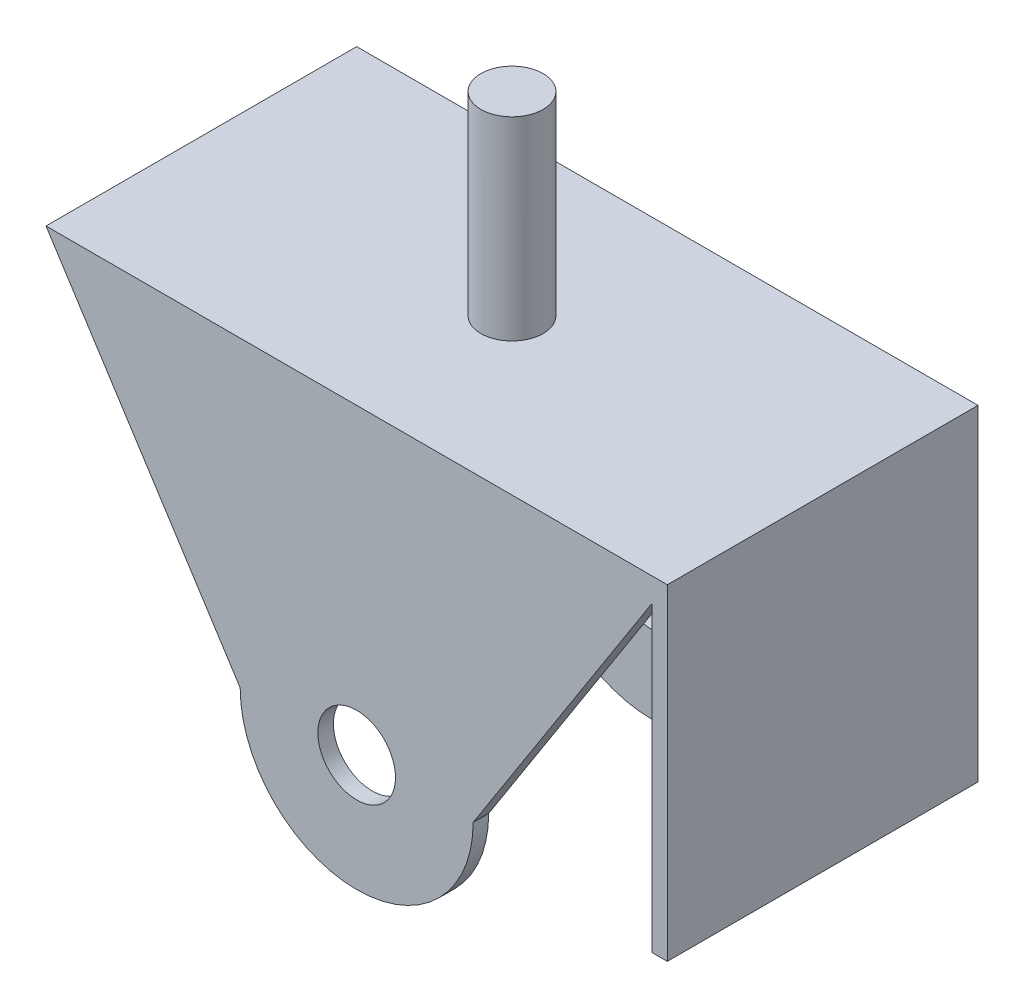
ISO-10303-21;
HEADER;
FILE_DESCRIPTION(('STEP AP214'),'2;1');
FILE_NAME('part.step','',(''),(''),'','','');
FILE_SCHEMA(('AUTOMOTIVE_DESIGN { 1 0 10303 214 1 1 1 1 }'));
ENDSEC;
DATA;
#1=APPLICATION_CONTEXT('core data for automotive mechanical design processes');
#2=APPLICATION_PROTOCOL_DEFINITION('international standard','automotive_design',2000,#1);
#3=PRODUCT_CONTEXT('',#1,'mechanical');
#4=PRODUCT('Part','Part','',(#3));
#5=PRODUCT_RELATED_PRODUCT_CATEGORY('part','',(#4));
#6=PRODUCT_DEFINITION_FORMATION('','',#4);
#7=PRODUCT_DEFINITION_CONTEXT('part definition',#1,'design');
#8=PRODUCT_DEFINITION('design','',#6,#7);
#9=PRODUCT_DEFINITION_SHAPE('','',#8);
#10=(LENGTH_UNIT() NAMED_UNIT(*) SI_UNIT(.MILLI.,.METRE.));
#11=(NAMED_UNIT(*) PLANE_ANGLE_UNIT() SI_UNIT($,.RADIAN.));
#12=(NAMED_UNIT(*) SI_UNIT($,.STERADIAN.) SOLID_ANGLE_UNIT());
#13=UNCERTAINTY_MEASURE_WITH_UNIT(LENGTH_MEASURE(1.E-05),#10,'distance_accuracy_value','');
#14=(GEOMETRIC_REPRESENTATION_CONTEXT(3) GLOBAL_UNCERTAINTY_ASSIGNED_CONTEXT((#13)) GLOBAL_UNIT_ASSIGNED_CONTEXT((#10,
#11,#12)) REPRESENTATION_CONTEXT('',''));
#15=CARTESIAN_POINT('',(0.,0.,0.));
#16=DIRECTION('',(0.,0.,1.));
#17=DIRECTION('',(1.,0.,0.));
#18=AXIS2_PLACEMENT_3D('',#15,#16,#17);
#19=CARTESIAN_POINT('',(15.,0.,40.));
#20=DIRECTION('',(-0.841879138963874,0.539666114720432,0.));
#21=DIRECTION('',(-0.539666114720432,-0.841879138963874,0.));
#22=AXIS2_PLACEMENT_3D('',#19,#20,#21);
#23=PLANE('',#22);
#24=DIRECTION('',(0.539666114720432,0.841879138963874,0.));
#25=VECTOR('',#24,1.);
#26=CARTESIAN_POINT('',(15.,0.,0.));
#27=LINE('',#26,#25);
#28=CARTESIAN_POINT('',(15.,0.,0.));
#29=VERTEX_POINT('',#28);
#30=CARTESIAN_POINT('',(38.,35.88,0.));
#31=VERTEX_POINT('',#30);
#32=EDGE_CURVE('E60',#29,#31,#27,.T.);
#33=ORIENTED_EDGE('',*,*,#32,.T.);
#34=DIRECTION('',(0.,0.,1.));
#35=VECTOR('',#34,1.);
#36=CARTESIAN_POINT('',(38.,35.88,40.));
#37=LINE('',#36,#35);
#38=CARTESIAN_POINT('',(38.,35.88,2.));
#39=VERTEX_POINT('',#38);
#40=EDGE_CURVE('E169',#31,#39,#37,.T.);
#41=ORIENTED_EDGE('',*,*,#40,.T.);
#42=DIRECTION('',(0.539666114720432,0.841879138963874,0.));
#43=VECTOR('',#42,1.);
#44=CARTESIAN_POINT('',(15.,0.,2.));
#45=LINE('',#44,#43);
#46=CARTESIAN_POINT('',(15.,0.,2.));
#47=VERTEX_POINT('',#46);
#48=EDGE_CURVE('E181',#47,#39,#45,.T.);
#49=ORIENTED_EDGE('',*,*,#48,.F.);
#50=DIRECTION('',(0.,0.,-1.));
#51=VECTOR('',#50,1.);
#52=CARTESIAN_POINT('',(15.,0.,40.));
#53=LINE('',#52,#51);
#54=EDGE_CURVE('E223',#47,#29,#53,.T.);
#55=ORIENTED_EDGE('',*,*,#54,.T.);
#56=EDGE_LOOP('',(#33,#41,#49,#55));
#57=FACE_BOUND('',#56,.T.);
#58=ADVANCED_FACE('F37',(#57),#23,.F.);
#59=CARTESIAN_POINT('',(0.,0.,40.));
#60=DIRECTION('',(0.,0.,-1.));
#61=DIRECTION('',(-1.,0.,0.));
#62=AXIS2_PLACEMENT_3D('',#59,#60,#61);
#63=CYLINDRICAL_SURFACE('',#62,15.);
#64=CARTESIAN_POINT('',(0.,0.,2.));
#65=DIRECTION('',(0.,0.,1.));
#66=DIRECTION('',(1.,0.,0.));
#67=AXIS2_PLACEMENT_3D('',#64,#65,#66);
#68=CIRCLE('',#67,15.);
#69=CARTESIAN_POINT('',(-15.,0.,2.));
#70=VERTEX_POINT('',#69);
#71=EDGE_CURVE('E183',#70,#47,#68,.T.);
#72=ORIENTED_EDGE('',*,*,#71,.F.);
#73=DIRECTION('',(0.,0.,-1.));
#74=VECTOR('',#73,1.);
#75=CARTESIAN_POINT('',(-15.,0.,40.));
#76=LINE('',#75,#74);
#77=CARTESIAN_POINT('',(-15.,0.,0.));
#78=VERTEX_POINT('',#77);
#79=EDGE_CURVE('E227',#70,#78,#76,.T.);
#80=ORIENTED_EDGE('',*,*,#79,.T.);
#81=CARTESIAN_POINT('',(0.,0.,0.));
#82=DIRECTION('',(0.,0.,1.));
#83=DIRECTION('',(1.,0.,0.));
#84=AXIS2_PLACEMENT_3D('',#81,#82,#83);
#85=CIRCLE('',#84,15.);
#86=EDGE_CURVE('E218',#78,#29,#85,.T.);
#87=ORIENTED_EDGE('',*,*,#86,.T.);
#88=ORIENTED_EDGE('',*,*,#54,.F.);
#89=EDGE_LOOP('',(#72,#80,#87,#88));
#90=FACE_BOUND('',#89,.T.);
#91=ADVANCED_FACE('F261',(#90),#63,.T.);
#92=CARTESIAN_POINT('',(0.,0.,40.));
#93=DIRECTION('',(0.,0.,-1.));
#94=DIRECTION('',(-1.,0.,0.));
#95=AXIS2_PLACEMENT_3D('',#92,#93,#94);
#96=CYLINDRICAL_SURFACE('',#95,5.);
#97=CARTESIAN_POINT('',(0.,0.,0.));
#98=DIRECTION('',(0.,0.,1.));
#99=DIRECTION('',(1.,0.,0.));
#100=AXIS2_PLACEMENT_3D('',#97,#98,#99);
#101=CIRCLE('',#100,5.);
#102=CARTESIAN_POINT('',(5.,0.,0.));
#103=VERTEX_POINT('',#102);
#104=EDGE_CURVE('E199',#103,#103,#101,.T.);
#105=ORIENTED_EDGE('',*,*,#104,.F.);
#106=EDGE_LOOP('',(#105));
#107=FACE_BOUND('',#106,.T.);
#108=CARTESIAN_POINT('',(0.,0.,2.));
#109=DIRECTION('',(0.,0.,1.));
#110=DIRECTION('',(1.,0.,0.));
#111=AXIS2_PLACEMENT_3D('',#108,#109,#110);
#112=CIRCLE('',#111,5.);
#113=CARTESIAN_POINT('',(5.,0.,2.));
#114=VERTEX_POINT('',#113);
#115=EDGE_CURVE('E180',#114,#114,#112,.T.);
#116=ORIENTED_EDGE('',*,*,#115,.T.);
#117=EDGE_LOOP('',(#116));
#118=FACE_BOUND('',#117,.T.);
#119=ADVANCED_FACE('F288',(#107,#118),#96,.F.);
#120=CARTESIAN_POINT('',(0.,0.,40.));
#121=DIRECTION('',(0.,0.,1.));
#122=DIRECTION('',(1.,0.,0.));
#123=AXIS2_PLACEMENT_3D('',#120,#121,#122);
#124=PLANE('',#123);
#125=DIRECTION('',(0.539666114720432,0.841879138963874,0.));
#126=VECTOR('',#125,1.);
#127=CARTESIAN_POINT('',(15.,0.,40.));
#128=LINE('',#127,#126);
#129=CARTESIAN_POINT('',(15.,0.,40.));
#130=VERTEX_POINT('',#129);
#131=CARTESIAN_POINT('',(38.,35.88,40.));
#132=VERTEX_POINT('',#131);
#133=EDGE_CURVE('E211',#130,#132,#128,.T.);
#134=ORIENTED_EDGE('',*,*,#133,.T.);
#135=DIRECTION('',(0.,1.,0.));
#136=VECTOR('',#135,1.);
#137=CARTESIAN_POINT('',(38.,-3.,40.));
#138=LINE('',#137,#136);
#139=CARTESIAN_POINT('',(38.,-3.,40.));
#140=VERTEX_POINT('',#139);
#141=EDGE_CURVE('E163',#140,#132,#138,.T.);
#142=ORIENTED_EDGE('',*,*,#141,.F.);
#143=DIRECTION('',(1.,0.,0.));
#144=VECTOR('',#143,1.);
#145=CARTESIAN_POINT('',(40.,-3.,40.));
#146=LINE('',#145,#144);
#147=CARTESIAN_POINT('',(40.,-3.,40.));
#148=VERTEX_POINT('',#147);
#149=EDGE_CURVE('E142',#140,#148,#146,.T.);
#150=ORIENTED_EDGE('',*,*,#149,.T.);
#151=DIRECTION('',(0.,1.,0.));
#152=VECTOR('',#151,1.);
#153=CARTESIAN_POINT('',(40.,-3.,40.));
#154=LINE('',#153,#152);
#155=CARTESIAN_POINT('',(40.,39.,40.));
#156=VERTEX_POINT('',#155);
#157=EDGE_CURVE('E156',#148,#156,#154,.T.);
#158=ORIENTED_EDGE('',*,*,#157,.T.);
#159=DIRECTION('',(-1.,0.,0.));
#160=VECTOR('',#159,1.);
#161=CARTESIAN_POINT('',(0.,39.,40.));
#162=LINE('',#161,#160);
#163=CARTESIAN_POINT('',(-40.,39.,40.));
#164=VERTEX_POINT('',#163);
#165=EDGE_CURVE('E205',#156,#164,#162,.T.);
#166=ORIENTED_EDGE('',*,*,#165,.T.);
#167=DIRECTION('',(0.539666114720432,-0.841879138963874,0.));
#168=VECTOR('',#167,1.);
#169=CARTESIAN_POINT('',(-40.,39.,40.));
#170=LINE('',#169,#168);
#171=CARTESIAN_POINT('',(-15.,0.,40.));
#172=VERTEX_POINT('',#171);
#173=EDGE_CURVE('E207',#164,#172,#170,.T.);
#174=ORIENTED_EDGE('',*,*,#173,.T.);
#175=CARTESIAN_POINT('',(0.,0.,40.));
#176=DIRECTION('',(0.,0.,1.));
#177=DIRECTION('',(1.,0.,0.));
#178=AXIS2_PLACEMENT_3D('',#175,#176,#177);
#179=CIRCLE('',#178,15.);
#180=EDGE_CURVE('E209',#172,#130,#179,.T.);
#181=ORIENTED_EDGE('',*,*,#180,.T.);
#182=EDGE_LOOP('',(#134,#142,#150,#158,#166,#174,#181));
#183=FACE_BOUND('',#182,.T.);
#184=CARTESIAN_POINT('',(0.,0.,40.));
#185=DIRECTION('',(0.,0.,1.));
#186=DIRECTION('',(1.,0.,0.));
#187=AXIS2_PLACEMENT_3D('',#184,#185,#186);
#188=CIRCLE('',#187,5.);
#189=CARTESIAN_POINT('',(5.,0.,40.));
#190=VERTEX_POINT('',#189);
#191=EDGE_CURVE('E200',#190,#190,#188,.T.);
#192=ORIENTED_EDGE('',*,*,#191,.F.);
#193=EDGE_LOOP('',(#192));
#194=FACE_BOUND('',#193,.T.);
#195=ADVANCED_FACE('F252',(#183,#194),#124,.T.);
#196=CARTESIAN_POINT('',(0.,0.,0.));
#197=DIRECTION('',(0.,0.,1.));
#198=DIRECTION('',(1.,0.,0.));
#199=AXIS2_PLACEMENT_3D('',#196,#197,#198);
#200=PLANE('',#199);
#201=DIRECTION('',(0.539666114720432,-0.841879138963874,0.));
#202=VECTOR('',#201,1.);
#203=CARTESIAN_POINT('',(-40.,39.,0.));
#204=LINE('',#203,#202);
#205=CARTESIAN_POINT('',(-40.,39.,0.));
#206=VERTEX_POINT('',#205);
#207=EDGE_CURVE('E215',#206,#78,#204,.T.);
#208=ORIENTED_EDGE('',*,*,#207,.F.);
#209=DIRECTION('',(-1.,0.,0.));
#210=VECTOR('',#209,1.);
#211=CARTESIAN_POINT('',(0.,39.,0.));
#212=LINE('',#211,#210);
#213=CARTESIAN_POINT('',(40.,39.,0.));
#214=VERTEX_POINT('',#213);
#215=EDGE_CURVE('E136',#214,#206,#212,.T.);
#216=ORIENTED_EDGE('',*,*,#215,.F.);
#217=DIRECTION('',(0.,1.,0.));
#218=VECTOR('',#217,1.);
#219=CARTESIAN_POINT('',(40.,-3.,0.));
#220=LINE('',#219,#218);
#221=CARTESIAN_POINT('',(40.,-3.,0.));
#222=VERTEX_POINT('',#221);
#223=EDGE_CURVE('E129',#222,#214,#220,.T.);
#224=ORIENTED_EDGE('',*,*,#223,.F.);
#225=DIRECTION('',(-1.,0.,0.));
#226=VECTOR('',#225,1.);
#227=CARTESIAN_POINT('',(40.,-3.,0.));
#228=LINE('',#227,#226);
#229=CARTESIAN_POINT('',(38.,-3.,0.));
#230=VERTEX_POINT('',#229);
#231=EDGE_CURVE('E135',#222,#230,#228,.T.);
#232=ORIENTED_EDGE('',*,*,#231,.T.);
#233=DIRECTION('',(0.,1.,0.));
#234=VECTOR('',#233,1.);
#235=CARTESIAN_POINT('',(38.,-3.,0.));
#236=LINE('',#235,#234);
#237=EDGE_CURVE('E141',#230,#31,#236,.T.);
#238=ORIENTED_EDGE('',*,*,#237,.T.);
#239=ORIENTED_EDGE('',*,*,#32,.F.);
#240=ORIENTED_EDGE('',*,*,#86,.F.);
#241=EDGE_LOOP('',(#208,#216,#224,#232,#238,#239,#240));
#242=FACE_BOUND('',#241,.T.);
#243=ORIENTED_EDGE('',*,*,#104,.T.);
#244=EDGE_LOOP('',(#243));
#245=FACE_BOUND('',#244,.T.);
#246=ADVANCED_FACE('F132',(#242,#245),#200,.F.);
#247=CARTESIAN_POINT('',(0.,39.,40.));
#248=DIRECTION('',(0.,-1.,0.));
#249=DIRECTION('',(1.,0.,0.));
#250=AXIS2_PLACEMENT_3D('',#247,#248,#249);
#251=PLANE('',#250);
#252=CARTESIAN_POINT('',(0.,39.,20.));
#253=DIRECTION('',(0.,-1.,0.));
#254=DIRECTION('',(1.,0.,0.));
#255=AXIS2_PLACEMENT_3D('',#252,#253,#254);
#256=CIRCLE('',#255,4.);
#257=CARTESIAN_POINT('',(4.,39.,20.));
#258=VERTEX_POINT('',#257);
#259=EDGE_CURVE('E45',#258,#258,#256,.F.);
#260=ORIENTED_EDGE('',*,*,#259,.F.);
#261=EDGE_LOOP('',(#260));
#262=FACE_BOUND('',#261,.T.);
#263=DIRECTION('',(0.,0.,-1.));
#264=VECTOR('',#263,1.);
#265=CARTESIAN_POINT('',(-40.,39.,40.));
#266=LINE('',#265,#264);
#267=EDGE_CURVE('E231',#164,#206,#266,.T.);
#268=ORIENTED_EDGE('',*,*,#267,.F.);
#269=ORIENTED_EDGE('',*,*,#165,.F.);
#270=DIRECTION('',(0.,0.,-1.));
#271=VECTOR('',#270,1.);
#272=CARTESIAN_POINT('',(40.,39.,40.));
#273=LINE('',#272,#271);
#274=EDGE_CURVE('E213',#156,#214,#273,.T.);
#275=ORIENTED_EDGE('',*,*,#274,.T.);
#276=ORIENTED_EDGE('',*,*,#215,.T.);
#277=EDGE_LOOP('',(#268,#269,#275,#276));
#278=FACE_BOUND('',#277,.T.);
#279=ADVANCED_FACE('F39',(#262,#278),#251,.F.);
#280=CARTESIAN_POINT('',(-40.,39.,40.));
#281=DIRECTION('',(0.841879138963874,0.539666114720432,0.));
#282=DIRECTION('',(-0.539666114720432,0.841879138963874,0.));
#283=AXIS2_PLACEMENT_3D('',#280,#281,#282);
#284=PLANE('',#283);
#285=DIRECTION('',(0.,0.,-1.));
#286=VECTOR('',#285,1.);
#287=CARTESIAN_POINT('',(-38.7179487179487,37.,40.));
#288=LINE('',#287,#286);
#289=CARTESIAN_POINT('',(-38.7179487179487,37.,38.));
#290=VERTEX_POINT('',#289);
#291=CARTESIAN_POINT('',(-38.7179487179487,37.,2.));
#292=VERTEX_POINT('',#291);
#293=EDGE_CURVE('E196',#290,#292,#288,.T.);
#294=ORIENTED_EDGE('',*,*,#293,.F.);
#295=DIRECTION('',(0.539666114720432,-0.841879138963874,0.));
#296=VECTOR('',#295,1.);
#297=CARTESIAN_POINT('',(-40.,39.,38.));
#298=LINE('',#297,#296);
#299=CARTESIAN_POINT('',(-15.,0.,38.));
#300=VERTEX_POINT('',#299);
#301=EDGE_CURVE('E193',#290,#300,#298,.T.);
#302=ORIENTED_EDGE('',*,*,#301,.T.);
#303=EDGE_CURVE('E228',#172,#300,#76,.T.);
#304=ORIENTED_EDGE('',*,*,#303,.F.);
#305=ORIENTED_EDGE('',*,*,#173,.F.);
#306=ORIENTED_EDGE('',*,*,#267,.T.);
#307=ORIENTED_EDGE('',*,*,#207,.T.);
#308=ORIENTED_EDGE('',*,*,#79,.F.);
#309=DIRECTION('',(0.539666114720432,-0.841879138963874,0.));
#310=VECTOR('',#309,1.);
#311=CARTESIAN_POINT('',(-40.,39.,2.));
#312=LINE('',#311,#310);
#313=EDGE_CURVE('E185',#292,#70,#312,.T.);
#314=ORIENTED_EDGE('',*,*,#313,.F.);
#315=EDGE_LOOP('',(#294,#302,#304,#305,#306,#307,#308,#314));
#316=FACE_BOUND('',#315,.T.);
#317=ADVANCED_FACE('F244',(#316),#284,.F.);
#318=ORIENTED_EDGE('',*,*,#303,.T.);
#319=CARTESIAN_POINT('',(0.,0.,38.));
#320=DIRECTION('',(0.,0.,1.));
#321=DIRECTION('',(1.,0.,0.));
#322=AXIS2_PLACEMENT_3D('',#319,#320,#321);
#323=CIRCLE('',#322,15.);
#324=CARTESIAN_POINT('',(15.,0.,38.));
#325=VERTEX_POINT('',#324);
#326=EDGE_CURVE('E190',#300,#325,#323,.T.);
#327=ORIENTED_EDGE('',*,*,#326,.T.);
#328=EDGE_CURVE('E224',#130,#325,#53,.T.);
#329=ORIENTED_EDGE('',*,*,#328,.F.);
#330=ORIENTED_EDGE('',*,*,#180,.F.);
#331=EDGE_LOOP('',(#318,#327,#329,#330));
#332=FACE_BOUND('',#331,.T.);
#333=ADVANCED_FACE('F277',(#332),#63,.T.);
#334=DIRECTION('',(0.539666114720432,0.841879138963874,0.));
#335=VECTOR('',#334,1.);
#336=CARTESIAN_POINT('',(15.,0.,38.));
#337=LINE('',#336,#335);
#338=CARTESIAN_POINT('',(38.,35.88,38.));
#339=VERTEX_POINT('',#338);
#340=EDGE_CURVE('E188',#325,#339,#337,.T.);
#341=ORIENTED_EDGE('',*,*,#340,.T.);
#342=EDGE_CURVE('E52',#339,#132,#37,.T.);
#343=ORIENTED_EDGE('',*,*,#342,.T.);
#344=ORIENTED_EDGE('',*,*,#133,.F.);
#345=ORIENTED_EDGE('',*,*,#328,.T.);
#346=EDGE_LOOP('',(#341,#343,#344,#345));
#347=FACE_BOUND('',#346,.T.);
#348=ADVANCED_FACE('F278',(#347),#23,.F.);
#349=CARTESIAN_POINT('',(0.,0.,38.));
#350=DIRECTION('',(0.,0.,1.));
#351=DIRECTION('',(1.,0.,0.));
#352=AXIS2_PLACEMENT_3D('',#349,#350,#351);
#353=CIRCLE('',#352,5.);
#354=CARTESIAN_POINT('',(5.,0.,38.));
#355=VERTEX_POINT('',#354);
#356=EDGE_CURVE('E187',#355,#355,#353,.T.);
#357=ORIENTED_EDGE('',*,*,#356,.F.);
#358=EDGE_LOOP('',(#357));
#359=FACE_BOUND('',#358,.T.);
#360=ORIENTED_EDGE('',*,*,#191,.T.);
#361=EDGE_LOOP('',(#360));
#362=FACE_BOUND('',#361,.T.);
#363=ADVANCED_FACE('F280',(#359,#362),#96,.F.);
#364=CARTESIAN_POINT('',(40.6473580112255,37.,38.));
#365=DIRECTION('',(0.,-1.,0.));
#366=DIRECTION('',(0.,0.,-1.));
#367=AXIS2_PLACEMENT_3D('',#364,#365,#366);
#368=PLANE('',#367);
#369=DIRECTION('',(0.,0.,-1.));
#370=VECTOR('',#369,1.);
#371=CARTESIAN_POINT('',(38.,37.,38.));
#372=LINE('',#371,#370);
#373=CARTESIAN_POINT('',(38.,37.,38.));
#374=VERTEX_POINT('',#373);
#375=CARTESIAN_POINT('',(38.,37.,2.));
#376=VERTEX_POINT('',#375);
#377=EDGE_CURVE('E162',#374,#376,#372,.T.);
#378=ORIENTED_EDGE('',*,*,#377,.F.);
#379=DIRECTION('',(-1.,0.,0.));
#380=VECTOR('',#379,1.);
#381=CARTESIAN_POINT('',(40.6473580112255,37.,38.));
#382=LINE('',#381,#380);
#383=EDGE_CURVE('E178',#374,#290,#382,.T.);
#384=ORIENTED_EDGE('',*,*,#383,.T.);
#385=ORIENTED_EDGE('',*,*,#293,.T.);
#386=DIRECTION('',(-1.,0.,0.));
#387=VECTOR('',#386,1.);
#388=CARTESIAN_POINT('',(40.6473580112255,37.,2.));
#389=LINE('',#388,#387);
#390=EDGE_CURVE('E176',#376,#292,#389,.T.);
#391=ORIENTED_EDGE('',*,*,#390,.F.);
#392=EDGE_LOOP('',(#378,#384,#385,#391));
#393=FACE_BOUND('',#392,.T.);
#394=ADVANCED_FACE('F270',(#393),#368,.T.);
#395=CARTESIAN_POINT('',(0.,0.,38.));
#396=DIRECTION('',(0.,0.,1.));
#397=DIRECTION('',(1.,0.,0.));
#398=AXIS2_PLACEMENT_3D('',#395,#396,#397);
#399=PLANE('',#398);
#400=ORIENTED_EDGE('',*,*,#356,.T.);
#401=EDGE_LOOP('',(#400));
#402=FACE_BOUND('',#401,.T.);
#403=ORIENTED_EDGE('',*,*,#383,.F.);
#404=DIRECTION('',(0.,-1.,0.));
#405=VECTOR('',#404,1.);
#406=CARTESIAN_POINT('',(38.,0.,38.));
#407=LINE('',#406,#405);
#408=EDGE_CURVE('E171',#374,#339,#407,.T.);
#409=ORIENTED_EDGE('',*,*,#408,.T.);
#410=ORIENTED_EDGE('',*,*,#340,.F.);
#411=ORIENTED_EDGE('',*,*,#326,.F.);
#412=ORIENTED_EDGE('',*,*,#301,.F.);
#413=EDGE_LOOP('',(#403,#409,#410,#411,#412));
#414=FACE_BOUND('',#413,.T.);
#415=ADVANCED_FACE('F275',(#402,#414),#399,.F.);
#416=CARTESIAN_POINT('',(0.,0.,2.));
#417=DIRECTION('',(0.,0.,1.));
#418=DIRECTION('',(1.,0.,0.));
#419=AXIS2_PLACEMENT_3D('',#416,#417,#418);
#420=PLANE('',#419);
#421=DIRECTION('',(0.,-1.,0.));
#422=VECTOR('',#421,1.);
#423=CARTESIAN_POINT('',(38.,0.,2.));
#424=LINE('',#423,#422);
#425=EDGE_CURVE('E11',#376,#39,#424,.T.);
#426=ORIENTED_EDGE('',*,*,#425,.F.);
#427=ORIENTED_EDGE('',*,*,#390,.T.);
#428=ORIENTED_EDGE('',*,*,#313,.T.);
#429=ORIENTED_EDGE('',*,*,#71,.T.);
#430=ORIENTED_EDGE('',*,*,#48,.T.);
#431=EDGE_LOOP('',(#426,#427,#428,#429,#430));
#432=FACE_BOUND('',#431,.T.);
#433=ORIENTED_EDGE('',*,*,#115,.F.);
#434=EDGE_LOOP('',(#433));
#435=FACE_BOUND('',#434,.T.);
#436=ADVANCED_FACE('F265',(#432,#435),#420,.T.);
#437=CARTESIAN_POINT('',(0.,64.,20.));
#438=DIRECTION('',(0.,-1.,0.));
#439=DIRECTION('',(0.,0.,-1.));
#440=AXIS2_PLACEMENT_3D('',#437,#438,#439);
#441=CYLINDRICAL_SURFACE('',#440,4.);
#442=CARTESIAN_POINT('',(0.,64.,20.));
#443=DIRECTION('',(0.,1.,0.));
#444=DIRECTION('',(0.,0.,1.));
#445=AXIS2_PLACEMENT_3D('',#442,#443,#444);
#446=CIRCLE('',#445,4.);
#447=CARTESIAN_POINT('',(0.,64.,24.));
#448=VERTEX_POINT('',#447);
#449=EDGE_CURVE('E173',#448,#448,#446,.T.);
#450=ORIENTED_EDGE('',*,*,#449,.F.);
#451=EDGE_LOOP('',(#450));
#452=FACE_BOUND('',#451,.T.);
#453=ORIENTED_EDGE('',*,*,#259,.T.);
#454=EDGE_LOOP('',(#453));
#455=FACE_BOUND('',#454,.T.);
#456=ADVANCED_FACE('F240',(#452,#455),#441,.T.);
#457=CARTESIAN_POINT('',(0.,64.,20.));
#458=DIRECTION('',(0.,1.,0.));
#459=DIRECTION('',(0.,0.,1.));
#460=AXIS2_PLACEMENT_3D('',#457,#458,#459);
#461=PLANE('',#460);
#462=ORIENTED_EDGE('',*,*,#449,.T.);
#463=EDGE_LOOP('',(#462));
#464=FACE_BOUND('',#463,.T.);
#465=ADVANCED_FACE('F328',(#464),#461,.T.);
#466=CARTESIAN_POINT('',(38.,-3.,0.));
#467=DIRECTION('',(-1.,0.,0.));
#468=DIRECTION('',(0.,0.,1.));
#469=AXIS2_PLACEMENT_3D('',#466,#467,#468);
#470=PLANE('',#469);
#471=ORIENTED_EDGE('',*,*,#342,.F.);
#472=ORIENTED_EDGE('',*,*,#408,.F.);
#473=ORIENTED_EDGE('',*,*,#377,.T.);
#474=ORIENTED_EDGE('',*,*,#425,.T.);
#475=ORIENTED_EDGE('',*,*,#40,.F.);
#476=ORIENTED_EDGE('',*,*,#237,.F.);
#477=DIRECTION('',(0.,0.,1.));
#478=VECTOR('',#477,1.);
#479=CARTESIAN_POINT('',(38.,-3.,0.));
#480=LINE('',#479,#478);
#481=EDGE_CURVE('E152',#230,#140,#480,.T.);
#482=ORIENTED_EDGE('',*,*,#481,.T.);
#483=ORIENTED_EDGE('',*,*,#141,.T.);
#484=EDGE_LOOP('',(#471,#472,#473,#474,#475,#476,#482,#483));
#485=FACE_BOUND('',#484,.T.);
#486=ADVANCED_FACE('F256',(#485),#470,.T.);
#487=CARTESIAN_POINT('',(40.,-3.,0.));
#488=DIRECTION('',(1.,0.,0.));
#489=DIRECTION('',(0.,1.,0.));
#490=AXIS2_PLACEMENT_3D('',#487,#488,#489);
#491=PLANE('',#490);
#492=ORIENTED_EDGE('',*,*,#274,.F.);
#493=ORIENTED_EDGE('',*,*,#157,.F.);
#494=DIRECTION('',(0.,0.,-1.));
#495=VECTOR('',#494,1.);
#496=CARTESIAN_POINT('',(40.,-3.,0.));
#497=LINE('',#496,#495);
#498=EDGE_CURVE('E149',#148,#222,#497,.T.);
#499=ORIENTED_EDGE('',*,*,#498,.T.);
#500=ORIENTED_EDGE('',*,*,#223,.T.);
#501=EDGE_LOOP('',(#492,#493,#499,#500));
#502=FACE_BOUND('',#501,.T.);
#503=ADVANCED_FACE('F154',(#502),#491,.T.);
#504=CARTESIAN_POINT('',(0.,-3.,0.));
#505=DIRECTION('',(0.,-1.,0.));
#506=DIRECTION('',(0.,0.,-1.));
#507=AXIS2_PLACEMENT_3D('',#504,#505,#506);
#508=PLANE('',#507);
#509=ORIENTED_EDGE('',*,*,#498,.F.);
#510=ORIENTED_EDGE('',*,*,#149,.F.);
#511=ORIENTED_EDGE('',*,*,#481,.F.);
#512=ORIENTED_EDGE('',*,*,#231,.F.);
#513=EDGE_LOOP('',(#509,#510,#511,#512));
#514=FACE_BOUND('',#513,.T.);
#515=ADVANCED_FACE('F147',(#514),#508,.T.);
#516=CLOSED_SHELL('',(#58,#91,#119,#195,#246,#279,#317,#333,#348,#363,#394,#415,#436,#456,#465,
#486,#503,#515));
#517=MANIFOLD_SOLID_BREP('B2',#516);
#518=ADVANCED_BREP_SHAPE_REPRESENTATION('',(#18,#517),#14);
#519=SHAPE_DEFINITION_REPRESENTATION(#9,#518);
ENDSEC;
END-ISO-10303-21;
